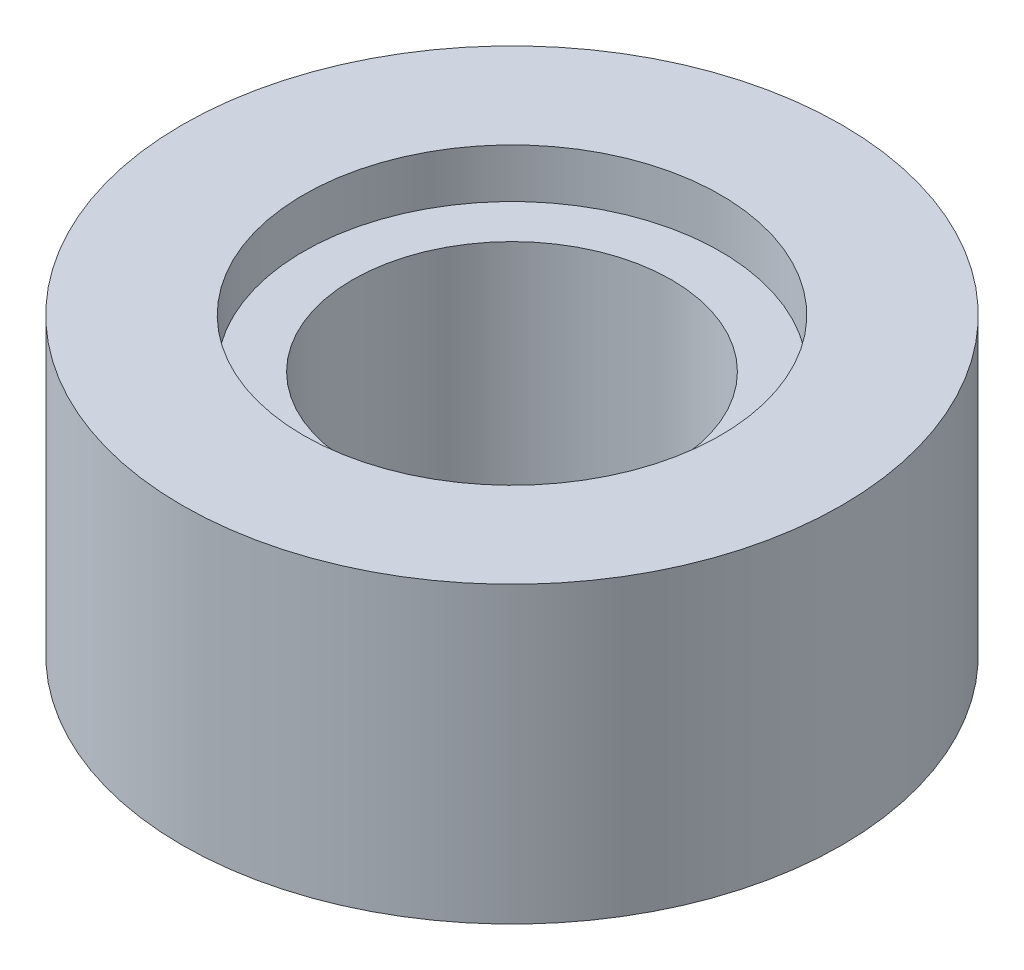
ISO-10303-21;
HEADER;
FILE_DESCRIPTION(('STEP AP214'),'2;1');
FILE_NAME('part.step','',(''),(''),'','','');
FILE_SCHEMA(('AUTOMOTIVE_DESIGN { 1 0 10303 214 1 1 1 1 }'));
ENDSEC;
DATA;
#1=APPLICATION_CONTEXT('core data for automotive mechanical design processes');
#2=APPLICATION_PROTOCOL_DEFINITION('international standard','automotive_design',2000,#1);
#3=PRODUCT_CONTEXT('',#1,'mechanical');
#4=PRODUCT('Part','Part','',(#3));
#5=PRODUCT_RELATED_PRODUCT_CATEGORY('part','',(#4));
#6=PRODUCT_DEFINITION_FORMATION('','',#4);
#7=PRODUCT_DEFINITION_CONTEXT('part definition',#1,'design');
#8=PRODUCT_DEFINITION('design','',#6,#7);
#9=PRODUCT_DEFINITION_SHAPE('','',#8);
#10=(LENGTH_UNIT() NAMED_UNIT(*) SI_UNIT(.MILLI.,.METRE.));
#11=(NAMED_UNIT(*) PLANE_ANGLE_UNIT() SI_UNIT($,.RADIAN.));
#12=(NAMED_UNIT(*) SI_UNIT($,.STERADIAN.) SOLID_ANGLE_UNIT());
#13=UNCERTAINTY_MEASURE_WITH_UNIT(LENGTH_MEASURE(1.E-05),#10,'distance_accuracy_value','');
#14=(GEOMETRIC_REPRESENTATION_CONTEXT(3) GLOBAL_UNCERTAINTY_ASSIGNED_CONTEXT((#13)) GLOBAL_UNIT_ASSIGNED_CONTEXT((#10,
#11,#12)) REPRESENTATION_CONTEXT('',''));
#15=CARTESIAN_POINT('',(0.,0.,0.));
#16=DIRECTION('',(0.,0.,1.));
#17=DIRECTION('',(1.,0.,0.));
#18=AXIS2_PLACEMENT_3D('',#15,#16,#17);
#19=CARTESIAN_POINT('',(0.,12.,0.));
#20=DIRECTION('',(0.,1.,0.));
#21=DIRECTION('',(0.,0.,1.));
#22=AXIS2_PLACEMENT_3D('',#19,#20,#21);
#23=PLANE('',#22);
#24=CARTESIAN_POINT('',(0.,12.,0.));
#25=DIRECTION('',(0.,1.,0.));
#26=DIRECTION('',(0.,0.,1.));
#27=AXIS2_PLACEMENT_3D('',#24,#25,#26);
#28=CIRCLE('',#27,8.5);
#29=CARTESIAN_POINT('',(0.,12.,8.5));
#30=VERTEX_POINT('',#29);
#31=EDGE_CURVE('E52',#30,#30,#28,.T.);
#32=ORIENTED_EDGE('',*,*,#31,.F.);
#33=EDGE_LOOP('',(#32));
#34=FACE_BOUND('',#33,.T.);
#35=CARTESIAN_POINT('',(0.,12.,0.));
#36=DIRECTION('',(0.,1.,0.));
#37=DIRECTION('',(0.,0.,1.));
#38=AXIS2_PLACEMENT_3D('',#35,#36,#37);
#39=CIRCLE('',#38,13.4439547716092);
#40=CARTESIAN_POINT('',(0.,12.,13.4439547716092));
#41=VERTEX_POINT('',#40);
#42=EDGE_CURVE('E63',#41,#41,#39,.T.);
#43=ORIENTED_EDGE('',*,*,#42,.T.);
#44=EDGE_LOOP('',(#43));
#45=FACE_BOUND('',#44,.T.);
#46=ADVANCED_FACE('F45',(#34,#45),#23,.T.);
#47=CARTESIAN_POINT('',(0.,10.,0.));
#48=DIRECTION('',(0.,1.,0.));
#49=DIRECTION('',(0.,0.,1.));
#50=AXIS2_PLACEMENT_3D('',#47,#48,#49);
#51=PLANE('',#50);
#52=CARTESIAN_POINT('',(0.,10.,0.));
#53=DIRECTION('',(0.,1.,0.));
#54=DIRECTION('',(0.,0.,1.));
#55=AXIS2_PLACEMENT_3D('',#52,#53,#54);
#56=CIRCLE('',#55,11.15);
#57=CARTESIAN_POINT('',(0.,10.,11.15));
#58=VERTEX_POINT('',#57);
#59=EDGE_CURVE('E11',#58,#58,#56,.T.);
#60=ORIENTED_EDGE('',*,*,#59,.F.);
#61=EDGE_LOOP('',(#60));
#62=FACE_BOUND('',#61,.T.);
#63=CARTESIAN_POINT('',(0.,10.,0.));
#64=DIRECTION('',(0.,1.,0.));
#65=DIRECTION('',(0.,0.,1.));
#66=AXIS2_PLACEMENT_3D('',#63,#64,#65);
#67=CIRCLE('',#66,8.5);
#68=CARTESIAN_POINT('',(0.,10.,8.5));
#69=VERTEX_POINT('',#68);
#70=EDGE_CURVE('E56',#69,#69,#67,.T.);
#71=ORIENTED_EDGE('',*,*,#70,.T.);
#72=EDGE_LOOP('',(#71));
#73=FACE_BOUND('',#72,.T.);
#74=ADVANCED_FACE('F47',(#62,#73),#51,.F.);
#75=CARTESIAN_POINT('',(0.,12.,0.));
#76=DIRECTION('',(0.,-1.,0.));
#77=DIRECTION('',(0.,0.,-1.));
#78=AXIS2_PLACEMENT_3D('',#75,#76,#77);
#79=CYLINDRICAL_SURFACE('',#78,8.5);
#80=ORIENTED_EDGE('',*,*,#31,.T.);
#81=EDGE_LOOP('',(#80));
#82=FACE_BOUND('',#81,.T.);
#83=ORIENTED_EDGE('',*,*,#70,.F.);
#84=EDGE_LOOP('',(#83));
#85=FACE_BOUND('',#84,.T.);
#86=ADVANCED_FACE('F78',(#82,#85),#79,.F.);
#87=CARTESIAN_POINT('',(0.,0.,0.));
#88=DIRECTION('',(0.,1.,0.));
#89=DIRECTION('',(0.,0.,1.));
#90=AXIS2_PLACEMENT_3D('',#87,#88,#89);
#91=CYLINDRICAL_SURFACE('',#90,11.15);
#92=CARTESIAN_POINT('',(0.,0.,0.));
#93=DIRECTION('',(0.,1.,0.));
#94=DIRECTION('',(0.,0.,1.));
#95=AXIS2_PLACEMENT_3D('',#92,#93,#94);
#96=CIRCLE('',#95,11.15);
#97=CARTESIAN_POINT('',(0.,0.,11.15));
#98=VERTEX_POINT('',#97);
#99=EDGE_CURVE('E66',#98,#98,#96,.T.);
#100=ORIENTED_EDGE('',*,*,#99,.F.);
#101=EDGE_LOOP('',(#100));
#102=FACE_BOUND('',#101,.T.);
#103=ORIENTED_EDGE('',*,*,#59,.T.);
#104=EDGE_LOOP('',(#103));
#105=FACE_BOUND('',#104,.T.);
#106=ADVANCED_FACE('F75',(#102,#105),#91,.F.);
#107=CARTESIAN_POINT('',(0.,0.,0.));
#108=DIRECTION('',(0.,1.,0.));
#109=DIRECTION('',(0.,0.,1.));
#110=AXIS2_PLACEMENT_3D('',#107,#108,#109);
#111=CYLINDRICAL_SURFACE('',#110,13.4439547716092);
#112=CARTESIAN_POINT('',(0.,0.,0.));
#113=DIRECTION('',(0.,1.,0.));
#114=DIRECTION('',(0.,0.,1.));
#115=AXIS2_PLACEMENT_3D('',#112,#113,#114);
#116=CIRCLE('',#115,13.4439547716092);
#117=CARTESIAN_POINT('',(0.,0.,13.4439547716092));
#118=VERTEX_POINT('',#117);
#119=EDGE_CURVE('E61',#118,#118,#116,.T.);
#120=ORIENTED_EDGE('',*,*,#119,.T.);
#121=EDGE_LOOP('',(#120));
#122=FACE_BOUND('',#121,.T.);
#123=ORIENTED_EDGE('',*,*,#42,.F.);
#124=EDGE_LOOP('',(#123));
#125=FACE_BOUND('',#124,.T.);
#126=ADVANCED_FACE('F77',(#122,#125),#111,.T.);
#127=CARTESIAN_POINT('',(0.,0.,0.));
#128=DIRECTION('',(0.,1.,0.));
#129=DIRECTION('',(0.,0.,1.));
#130=AXIS2_PLACEMENT_3D('',#127,#128,#129);
#131=PLANE('',#130);
#132=ORIENTED_EDGE('',*,*,#99,.T.);
#133=EDGE_LOOP('',(#132));
#134=FACE_BOUND('',#133,.T.);
#135=ORIENTED_EDGE('',*,*,#119,.F.);
#136=EDGE_LOOP('',(#135));
#137=FACE_BOUND('',#136,.T.);
#138=ADVANCED_FACE('F72',(#134,#137),#131,.F.);
#139=CLOSED_SHELL('',(#46,#74,#86,#106,#126,#138));
#140=MANIFOLD_SOLID_BREP('B2',#139);
#141=CARTESIAN_POINT('',(0.,10.,0.));
#142=DIRECTION('',(0.,1.,0.));
#143=DIRECTION('',(0.,0.,1.));
#144=AXIS2_PLACEMENT_3D('',#141,#142,#143);
#145=PLANE('',#144);
#146=CARTESIAN_POINT('',(0.,10.,0.));
#147=DIRECTION('',(0.,1.,0.));
#148=DIRECTION('',(0.,0.,1.));
#149=AXIS2_PLACEMENT_3D('',#146,#147,#148);
#150=CIRCLE('',#149,8.5);
#151=CARTESIAN_POINT('',(0.,10.,8.5));
#152=VERTEX_POINT('',#151);
#153=EDGE_CURVE('E44',#152,#152,#150,.T.);
#154=ORIENTED_EDGE('',*,*,#153,.T.);
#155=EDGE_LOOP('',(#154));
#156=FACE_BOUND('',#155,.T.);
#157=CARTESIAN_POINT('',(0.,10.,0.));
#158=DIRECTION('',(0.,1.,0.));
#159=DIRECTION('',(0.,0.,1.));
#160=AXIS2_PLACEMENT_3D('',#157,#158,#159);
#161=CIRCLE('',#160,6.5);
#162=CARTESIAN_POINT('',(0.,10.,6.5));
#163=VERTEX_POINT('',#162);
#164=EDGE_CURVE('E151',#163,#163,#161,.T.);
#165=ORIENTED_EDGE('',*,*,#164,.F.);
#166=EDGE_LOOP('',(#165));
#167=FACE_BOUND('',#166,.T.);
#168=ADVANCED_FACE('F140',(#156,#167),#145,.T.);
#169=CARTESIAN_POINT('',(0.,0.,0.));
#170=DIRECTION('',(0.,1.,0.));
#171=DIRECTION('',(0.,0.,1.));
#172=AXIS2_PLACEMENT_3D('',#169,#170,#171);
#173=PLANE('',#172);
#174=CARTESIAN_POINT('',(0.,0.,0.));
#175=DIRECTION('',(0.,1.,0.));
#176=DIRECTION('',(0.,0.,1.));
#177=AXIS2_PLACEMENT_3D('',#174,#175,#176);
#178=CIRCLE('',#177,8.5);
#179=CARTESIAN_POINT('',(0.,0.,8.5));
#180=VERTEX_POINT('',#179);
#181=EDGE_CURVE('E144',#180,#180,#178,.T.);
#182=ORIENTED_EDGE('',*,*,#181,.F.);
#183=EDGE_LOOP('',(#182));
#184=FACE_BOUND('',#183,.T.);
#185=CARTESIAN_POINT('',(0.,0.,0.));
#186=DIRECTION('',(0.,1.,0.));
#187=DIRECTION('',(0.,0.,1.));
#188=AXIS2_PLACEMENT_3D('',#185,#186,#187);
#189=CIRCLE('',#188,6.5);
#190=CARTESIAN_POINT('',(0.,0.,6.5));
#191=VERTEX_POINT('',#190);
#192=EDGE_CURVE('E153',#191,#191,#189,.T.);
#193=ORIENTED_EDGE('',*,*,#192,.T.);
#194=EDGE_LOOP('',(#193));
#195=FACE_BOUND('',#194,.T.);
#196=ADVANCED_FACE('F163',(#184,#195),#173,.F.);
#197=CARTESIAN_POINT('',(0.,10.,0.));
#198=DIRECTION('',(0.,-1.,0.));
#199=DIRECTION('',(0.,0.,-1.));
#200=AXIS2_PLACEMENT_3D('',#197,#198,#199);
#201=CYLINDRICAL_SURFACE('',#200,8.5);
#202=ORIENTED_EDGE('',*,*,#153,.F.);
#203=EDGE_LOOP('',(#202));
#204=FACE_BOUND('',#203,.T.);
#205=ORIENTED_EDGE('',*,*,#181,.T.);
#206=EDGE_LOOP('',(#205));
#207=FACE_BOUND('',#206,.T.);
#208=ADVANCED_FACE('F142',(#204,#207),#201,.T.);
#209=CARTESIAN_POINT('',(0.,10.,0.));
#210=DIRECTION('',(0.,-1.,0.));
#211=DIRECTION('',(0.,0.,-1.));
#212=AXIS2_PLACEMENT_3D('',#209,#210,#211);
#213=CYLINDRICAL_SURFACE('',#212,6.5);
#214=ORIENTED_EDGE('',*,*,#164,.T.);
#215=EDGE_LOOP('',(#214));
#216=FACE_BOUND('',#215,.T.);
#217=ORIENTED_EDGE('',*,*,#192,.F.);
#218=EDGE_LOOP('',(#217));
#219=FACE_BOUND('',#218,.T.);
#220=ADVANCED_FACE('F159',(#216,#219),#213,.F.);
#221=CLOSED_SHELL('',(#168,#196,#208,#220));
#222=MANIFOLD_SOLID_BREP('B6',#221);
#223=ADVANCED_BREP_SHAPE_REPRESENTATION('',(#18,#140,#222),#14);
#224=SHAPE_DEFINITION_REPRESENTATION(#9,#223);
ENDSEC;
END-ISO-10303-21;
